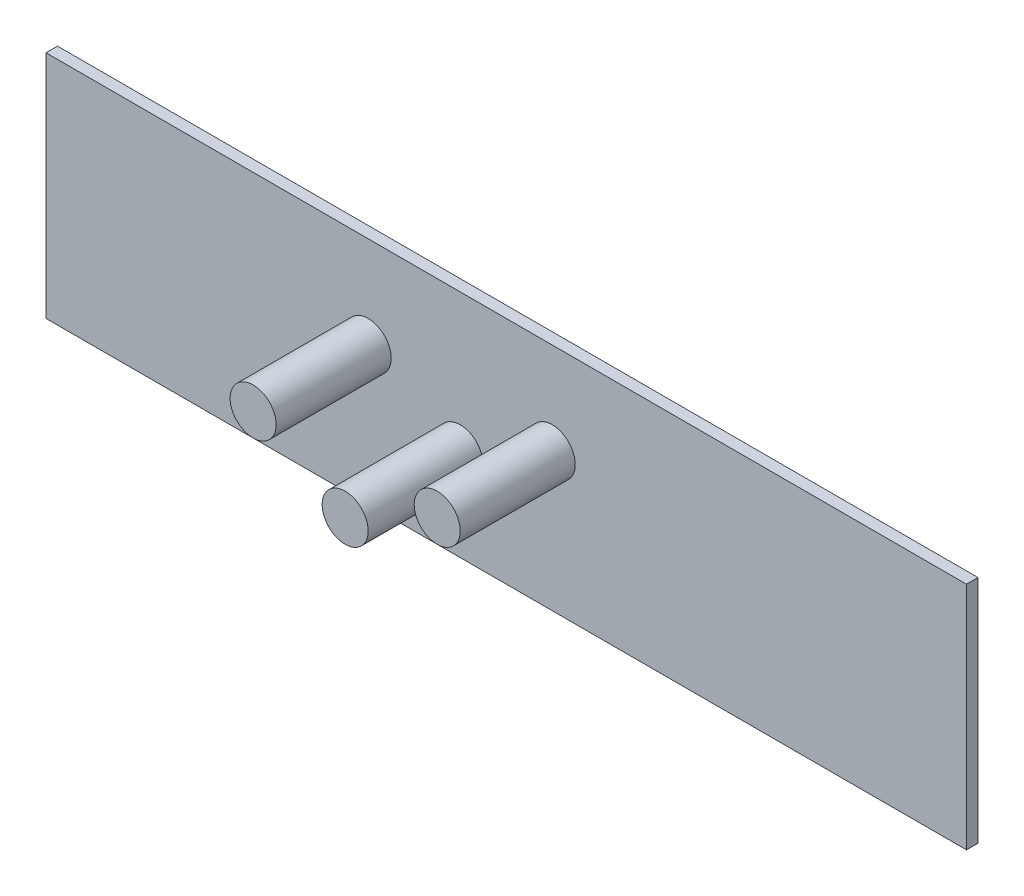
ISO-10303-21;
HEADER;
FILE_DESCRIPTION(('STEP AP214'),'2;1');
FILE_NAME('part.step','',(''),(''),'','','');
FILE_SCHEMA(('AUTOMOTIVE_DESIGN { 1 0 10303 214 1 1 1 1 }'));
ENDSEC;
DATA;
#1=APPLICATION_CONTEXT('core data for automotive mechanical design processes');
#2=APPLICATION_PROTOCOL_DEFINITION('international standard','automotive_design',2000,#1);
#3=PRODUCT_CONTEXT('',#1,'mechanical');
#4=PRODUCT('Part','Part','',(#3));
#5=PRODUCT_RELATED_PRODUCT_CATEGORY('part','',(#4));
#6=PRODUCT_DEFINITION_FORMATION('','',#4);
#7=PRODUCT_DEFINITION_CONTEXT('part definition',#1,'design');
#8=PRODUCT_DEFINITION('design','',#6,#7);
#9=PRODUCT_DEFINITION_SHAPE('','',#8);
#10=(LENGTH_UNIT() NAMED_UNIT(*) SI_UNIT(.MILLI.,.METRE.));
#11=(NAMED_UNIT(*) PLANE_ANGLE_UNIT() SI_UNIT($,.RADIAN.));
#12=(NAMED_UNIT(*) SI_UNIT($,.STERADIAN.) SOLID_ANGLE_UNIT());
#13=UNCERTAINTY_MEASURE_WITH_UNIT(LENGTH_MEASURE(1.E-05),#10,'distance_accuracy_value','');
#14=(GEOMETRIC_REPRESENTATION_CONTEXT(3) GLOBAL_UNCERTAINTY_ASSIGNED_CONTEXT((#13)) GLOBAL_UNIT_ASSIGNED_CONTEXT((#10,
#11,#12)) REPRESENTATION_CONTEXT('',''));
#15=CARTESIAN_POINT('',(0.,0.,0.));
#16=DIRECTION('',(0.,0.,1.));
#17=DIRECTION('',(1.,0.,0.));
#18=AXIS2_PLACEMENT_3D('',#15,#16,#17);
#19=CARTESIAN_POINT('',(-15000.,2500.,-250.));
#20=DIRECTION('',(-1.,0.,0.));
#21=DIRECTION('',(0.,0.,1.));
#22=AXIS2_PLACEMENT_3D('',#19,#20,#21);
#23=PLANE('',#22);
#24=DIRECTION('',(0.,-1.,0.));
#25=VECTOR('',#24,1.);
#26=CARTESIAN_POINT('',(-15000.,2500.,0.));
#27=LINE('',#26,#25);
#28=CARTESIAN_POINT('',(-15000.,2500.,0.));
#29=VERTEX_POINT('',#28);
#30=CARTESIAN_POINT('',(-15000.,-2500.,0.));
#31=VERTEX_POINT('',#30);
#32=EDGE_CURVE('E113',#29,#31,#27,.T.);
#33=ORIENTED_EDGE('',*,*,#32,.F.);
#34=DIRECTION('',(0.,0.,1.));
#35=VECTOR('',#34,1.);
#36=CARTESIAN_POINT('',(-15000.,2500.,-250.));
#37=LINE('',#36,#35);
#38=CARTESIAN_POINT('',(-15000.,2500.,-250.));
#39=VERTEX_POINT('',#38);
#40=EDGE_CURVE('E56',#39,#29,#37,.T.);
#41=ORIENTED_EDGE('',*,*,#40,.F.);
#42=DIRECTION('',(0.,-1.,0.));
#43=VECTOR('',#42,1.);
#44=CARTESIAN_POINT('',(-15000.,2500.,-250.));
#45=LINE('',#44,#43);
#46=CARTESIAN_POINT('',(-15000.,-2500.,-250.));
#47=VERTEX_POINT('',#46);
#48=EDGE_CURVE('E104',#39,#47,#45,.T.);
#49=ORIENTED_EDGE('',*,*,#48,.T.);
#50=DIRECTION('',(0.,0.,1.));
#51=VECTOR('',#50,1.);
#52=CARTESIAN_POINT('',(-15000.,-2500.,-250.));
#53=LINE('',#52,#51);
#54=EDGE_CURVE('E84',#47,#31,#53,.T.);
#55=ORIENTED_EDGE('',*,*,#54,.T.);
#56=EDGE_LOOP('',(#33,#41,#49,#55));
#57=FACE_BOUND('',#56,.T.);
#58=ADVANCED_FACE('F39',(#57),#23,.T.);
#59=CARTESIAN_POINT('',(5000.,2500.,-250.));
#60=DIRECTION('',(0.,1.,0.));
#61=DIRECTION('',(-1.,0.,0.));
#62=AXIS2_PLACEMENT_3D('',#59,#60,#61);
#63=PLANE('',#62);
#64=DIRECTION('',(-1.,0.,0.));
#65=VECTOR('',#64,1.);
#66=CARTESIAN_POINT('',(5000.,2500.,0.));
#67=LINE('',#66,#65);
#68=CARTESIAN_POINT('',(5000.,2500.,0.));
#69=VERTEX_POINT('',#68);
#70=EDGE_CURVE('E107',#69,#29,#67,.T.);
#71=ORIENTED_EDGE('',*,*,#70,.F.);
#72=DIRECTION('',(0.,0.,1.));
#73=VECTOR('',#72,1.);
#74=CARTESIAN_POINT('',(5000.,2500.,-250.));
#75=LINE('',#74,#73);
#76=CARTESIAN_POINT('',(5000.,2500.,-250.));
#77=VERTEX_POINT('',#76);
#78=EDGE_CURVE('E73',#77,#69,#75,.T.);
#79=ORIENTED_EDGE('',*,*,#78,.F.);
#80=DIRECTION('',(-1.,0.,0.));
#81=VECTOR('',#80,1.);
#82=CARTESIAN_POINT('',(5000.,2500.,-250.));
#83=LINE('',#82,#81);
#84=EDGE_CURVE('E99',#77,#39,#83,.T.);
#85=ORIENTED_EDGE('',*,*,#84,.T.);
#86=ORIENTED_EDGE('',*,*,#40,.T.);
#87=EDGE_LOOP('',(#71,#79,#85,#86));
#88=FACE_BOUND('',#87,.T.);
#89=ADVANCED_FACE('F149',(#88),#63,.T.);
#90=CARTESIAN_POINT('',(5000.,2500.,-250.));
#91=DIRECTION('',(1.,0.,0.));
#92=DIRECTION('',(0.,1.,0.));
#93=AXIS2_PLACEMENT_3D('',#90,#91,#92);
#94=PLANE('',#93);
#95=DIRECTION('',(0.,1.,0.));
#96=VECTOR('',#95,1.);
#97=CARTESIAN_POINT('',(5000.,2500.,0.));
#98=LINE('',#97,#96);
#99=CARTESIAN_POINT('',(5000.,-2500.,0.));
#100=VERTEX_POINT('',#99);
#101=EDGE_CURVE('E92',#100,#69,#98,.T.);
#102=ORIENTED_EDGE('',*,*,#101,.F.);
#103=DIRECTION('',(0.,0.,1.));
#104=VECTOR('',#103,1.);
#105=CARTESIAN_POINT('',(5000.,-2500.,-250.));
#106=LINE('',#105,#104);
#107=CARTESIAN_POINT('',(5000.,-2500.,-250.));
#108=VERTEX_POINT('',#107);
#109=EDGE_CURVE('E87',#108,#100,#106,.T.);
#110=ORIENTED_EDGE('',*,*,#109,.F.);
#111=DIRECTION('',(0.,1.,0.));
#112=VECTOR('',#111,1.);
#113=CARTESIAN_POINT('',(5000.,2500.,-250.));
#114=LINE('',#113,#112);
#115=EDGE_CURVE('E90',#108,#77,#114,.T.);
#116=ORIENTED_EDGE('',*,*,#115,.T.);
#117=ORIENTED_EDGE('',*,*,#78,.T.);
#118=EDGE_LOOP('',(#102,#110,#116,#117));
#119=FACE_BOUND('',#118,.T.);
#120=ADVANCED_FACE('F89',(#119),#94,.T.);
#121=CARTESIAN_POINT('',(5000.,-2500.,-250.));
#122=DIRECTION('',(0.,-1.,0.));
#123=DIRECTION('',(1.,0.,0.));
#124=AXIS2_PLACEMENT_3D('',#121,#122,#123);
#125=PLANE('',#124);
#126=DIRECTION('',(1.,0.,0.));
#127=VECTOR('',#126,1.);
#128=CARTESIAN_POINT('',(5000.,-2500.,0.));
#129=LINE('',#128,#127);
#130=EDGE_CURVE('E117',#31,#100,#129,.T.);
#131=ORIENTED_EDGE('',*,*,#130,.F.);
#132=ORIENTED_EDGE('',*,*,#54,.F.);
#133=DIRECTION('',(1.,0.,0.));
#134=VECTOR('',#133,1.);
#135=CARTESIAN_POINT('',(5000.,-2500.,-250.));
#136=LINE('',#135,#134);
#137=EDGE_CURVE('E98',#47,#108,#136,.T.);
#138=ORIENTED_EDGE('',*,*,#137,.T.);
#139=ORIENTED_EDGE('',*,*,#109,.T.);
#140=EDGE_LOOP('',(#131,#132,#138,#139));
#141=FACE_BOUND('',#140,.T.);
#142=ADVANCED_FACE('F102',(#141),#125,.T.);
#143=CARTESIAN_POINT('',(0.,0.,-250.));
#144=DIRECTION('',(0.,0.,-1.));
#145=DIRECTION('',(-1.,0.,0.));
#146=AXIS2_PLACEMENT_3D('',#143,#144,#145);
#147=PLANE('',#146);
#148=ORIENTED_EDGE('',*,*,#48,.F.);
#149=ORIENTED_EDGE('',*,*,#84,.F.);
#150=ORIENTED_EDGE('',*,*,#115,.F.);
#151=ORIENTED_EDGE('',*,*,#137,.F.);
#152=EDGE_LOOP('',(#148,#149,#150,#151));
#153=FACE_BOUND('',#152,.T.);
#154=ADVANCED_FACE('F97',(#153),#147,.T.);
#155=CARTESIAN_POINT('',(0.,0.,0.));
#156=DIRECTION('',(0.,0.,-1.));
#157=DIRECTION('',(-1.,0.,0.));
#158=AXIS2_PLACEMENT_3D('',#155,#156,#157);
#159=PLANE('',#158);
#160=CARTESIAN_POINT('',(-4000.,500.,0.));
#161=DIRECTION('',(0.,0.,-1.));
#162=DIRECTION('',(-1.,0.,0.));
#163=AXIS2_PLACEMENT_3D('',#160,#161,#162);
#164=CIRCLE('',#163,500.);
#165=CARTESIAN_POINT('',(-4500.,500.,0.));
#166=VERTEX_POINT('',#165);
#167=EDGE_CURVE('E11',#166,#166,#164,.F.);
#168=ORIENTED_EDGE('',*,*,#167,.F.);
#169=EDGE_LOOP('',(#168));
#170=FACE_BOUND('',#169,.T.);
#171=CARTESIAN_POINT('',(-6000.,-500.,0.));
#172=DIRECTION('',(0.,0.,-1.));
#173=DIRECTION('',(-1.,0.,0.));
#174=AXIS2_PLACEMENT_3D('',#171,#172,#173);
#175=CIRCLE('',#174,500.);
#176=CARTESIAN_POINT('',(-6500.,-500.,0.));
#177=VERTEX_POINT('',#176);
#178=EDGE_CURVE('E48',#177,#177,#175,.F.);
#179=ORIENTED_EDGE('',*,*,#178,.F.);
#180=EDGE_LOOP('',(#179));
#181=FACE_BOUND('',#180,.T.);
#182=CARTESIAN_POINT('',(-8000.,500.,0.));
#183=DIRECTION('',(0.,0.,-1.));
#184=DIRECTION('',(-1.,0.,0.));
#185=AXIS2_PLACEMENT_3D('',#182,#183,#184);
#186=CIRCLE('',#185,500.);
#187=CARTESIAN_POINT('',(-8500.,500.,0.));
#188=VERTEX_POINT('',#187);
#189=EDGE_CURVE('E128',#188,#188,#186,.F.);
#190=ORIENTED_EDGE('',*,*,#189,.F.);
#191=EDGE_LOOP('',(#190));
#192=FACE_BOUND('',#191,.T.);
#193=ORIENTED_EDGE('',*,*,#32,.T.);
#194=ORIENTED_EDGE('',*,*,#130,.T.);
#195=ORIENTED_EDGE('',*,*,#101,.T.);
#196=ORIENTED_EDGE('',*,*,#70,.T.);
#197=EDGE_LOOP('',(#193,#194,#195,#196));
#198=FACE_BOUND('',#197,.T.);
#199=ADVANCED_FACE('F141',(#170,#181,#192,#198),#159,.F.);
#200=CARTESIAN_POINT('',(-8000.,500.,2500.));
#201=DIRECTION('',(0.,0.,-1.));
#202=DIRECTION('',(-1.,0.,0.));
#203=AXIS2_PLACEMENT_3D('',#200,#201,#202);
#204=CYLINDRICAL_SURFACE('',#203,500.);
#205=CARTESIAN_POINT('',(-8000.,500.,2500.));
#206=DIRECTION('',(0.,0.,1.));
#207=DIRECTION('',(1.,0.,0.));
#208=AXIS2_PLACEMENT_3D('',#205,#206,#207);
#209=CIRCLE('',#208,500.);
#210=CARTESIAN_POINT('',(-7500.,500.,2500.));
#211=VERTEX_POINT('',#210);
#212=EDGE_CURVE('E118',#211,#211,#209,.T.);
#213=ORIENTED_EDGE('',*,*,#212,.F.);
#214=EDGE_LOOP('',(#213));
#215=FACE_BOUND('',#214,.T.);
#216=ORIENTED_EDGE('',*,*,#189,.T.);
#217=EDGE_LOOP('',(#216));
#218=FACE_BOUND('',#217,.T.);
#219=ADVANCED_FACE('F144',(#215,#218),#204,.T.);
#220=CARTESIAN_POINT('',(-8000.,500.,2500.));
#221=DIRECTION('',(0.,0.,1.));
#222=DIRECTION('',(1.,0.,0.));
#223=AXIS2_PLACEMENT_3D('',#220,#221,#222);
#224=PLANE('',#223);
#225=ORIENTED_EDGE('',*,*,#212,.T.);
#226=EDGE_LOOP('',(#225));
#227=FACE_BOUND('',#226,.T.);
#228=ADVANCED_FACE('F167',(#227),#224,.T.);
#229=CARTESIAN_POINT('',(-6000.,-500.,2500.));
#230=DIRECTION('',(0.,0.,-1.));
#231=DIRECTION('',(-1.,0.,0.));
#232=AXIS2_PLACEMENT_3D('',#229,#230,#231);
#233=CYLINDRICAL_SURFACE('',#232,500.);
#234=CARTESIAN_POINT('',(-6000.,-500.,2500.));
#235=DIRECTION('',(0.,0.,1.));
#236=DIRECTION('',(1.,0.,0.));
#237=AXIS2_PLACEMENT_3D('',#234,#235,#236);
#238=CIRCLE('',#237,500.);
#239=CARTESIAN_POINT('',(-5500.,-500.,2500.));
#240=VERTEX_POINT('',#239);
#241=EDGE_CURVE('E192',#240,#240,#238,.T.);
#242=ORIENTED_EDGE('',*,*,#241,.F.);
#243=EDGE_LOOP('',(#242));
#244=FACE_BOUND('',#243,.T.);
#245=ORIENTED_EDGE('',*,*,#178,.T.);
#246=EDGE_LOOP('',(#245));
#247=FACE_BOUND('',#246,.T.);
#248=ADVANCED_FACE('F139',(#244,#247),#233,.T.);
#249=CARTESIAN_POINT('',(-6000.,-500.,2500.));
#250=DIRECTION('',(0.,0.,1.));
#251=DIRECTION('',(1.,0.,0.));
#252=AXIS2_PLACEMENT_3D('',#249,#250,#251);
#253=PLANE('',#252);
#254=ORIENTED_EDGE('',*,*,#241,.T.);
#255=EDGE_LOOP('',(#254));
#256=FACE_BOUND('',#255,.T.);
#257=ADVANCED_FACE('F174',(#256),#253,.T.);
#258=CARTESIAN_POINT('',(-4000.,500.,2500.));
#259=DIRECTION('',(0.,0.,-1.));
#260=DIRECTION('',(-1.,0.,0.));
#261=AXIS2_PLACEMENT_3D('',#258,#259,#260);
#262=CYLINDRICAL_SURFACE('',#261,500.);
#263=CARTESIAN_POINT('',(-4000.,500.,2500.));
#264=DIRECTION('',(0.,0.,1.));
#265=DIRECTION('',(1.,0.,0.));
#266=AXIS2_PLACEMENT_3D('',#263,#264,#265);
#267=CIRCLE('',#266,500.);
#268=CARTESIAN_POINT('',(-3500.,500.,2500.));
#269=VERTEX_POINT('',#268);
#270=EDGE_CURVE('E190',#269,#269,#267,.T.);
#271=ORIENTED_EDGE('',*,*,#270,.F.);
#272=EDGE_LOOP('',(#271));
#273=FACE_BOUND('',#272,.T.);
#274=ORIENTED_EDGE('',*,*,#167,.T.);
#275=EDGE_LOOP('',(#274));
#276=FACE_BOUND('',#275,.T.);
#277=ADVANCED_FACE('F178',(#273,#276),#262,.T.);
#278=CARTESIAN_POINT('',(-4000.,500.,2500.));
#279=DIRECTION('',(0.,0.,1.));
#280=DIRECTION('',(1.,0.,0.));
#281=AXIS2_PLACEMENT_3D('',#278,#279,#280);
#282=PLANE('',#281);
#283=ORIENTED_EDGE('',*,*,#270,.T.);
#284=EDGE_LOOP('',(#283));
#285=FACE_BOUND('',#284,.T.);
#286=ADVANCED_FACE('F182',(#285),#282,.T.);
#287=CLOSED_SHELL('',(#58,#89,#120,#142,#154,#199,#219,#228,#248,#257,#277,#286));
#288=MANIFOLD_SOLID_BREP('B2',#287);
#289=ADVANCED_BREP_SHAPE_REPRESENTATION('',(#18,#288),#14);
#290=SHAPE_DEFINITION_REPRESENTATION(#9,#289);
ENDSEC;
END-ISO-10303-21;
